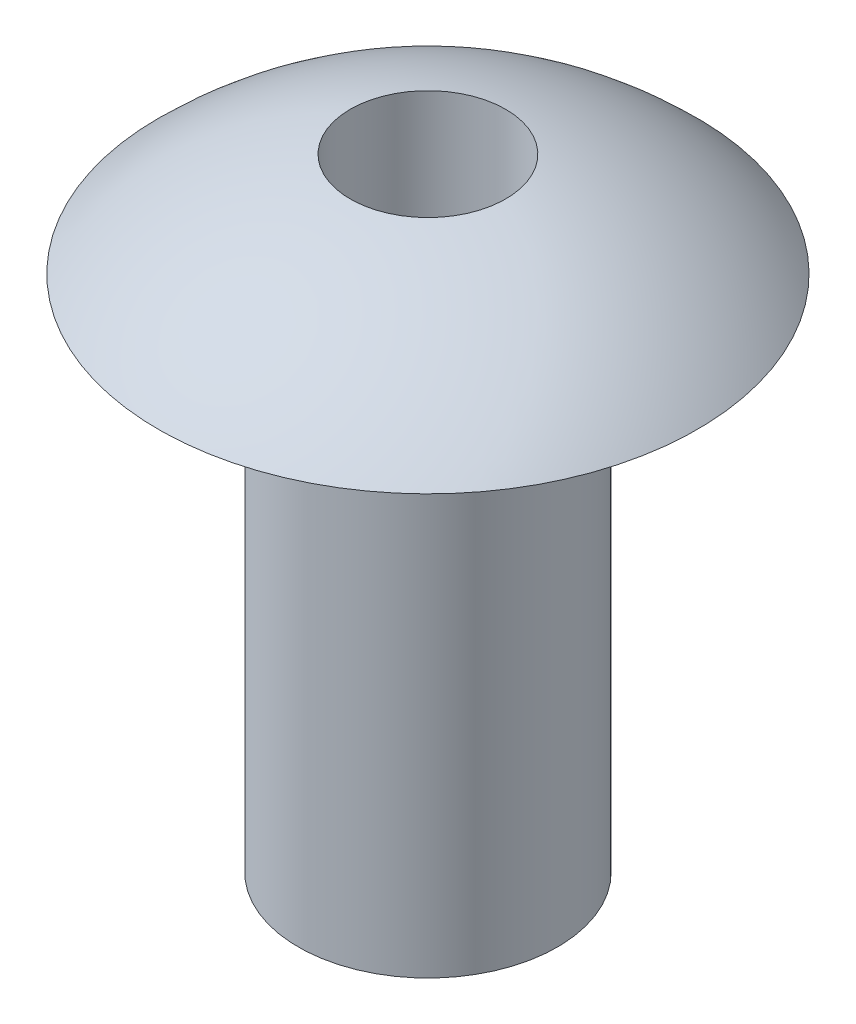
ISO-10303-21;
HEADER;
FILE_DESCRIPTION(('STEP AP214'),'2;1');
FILE_NAME('part.step','',(''),(''),'','','');
FILE_SCHEMA(('AUTOMOTIVE_DESIGN { 1 0 10303 214 1 1 1 1 }'));
ENDSEC;
DATA;
#1=APPLICATION_CONTEXT('core data for automotive mechanical design processes');
#2=APPLICATION_PROTOCOL_DEFINITION('international standard','automotive_design',2000,#1);
#3=PRODUCT_CONTEXT('',#1,'mechanical');
#4=PRODUCT('Part','Part','',(#3));
#5=PRODUCT_RELATED_PRODUCT_CATEGORY('part','',(#4));
#6=PRODUCT_DEFINITION_FORMATION('','',#4);
#7=PRODUCT_DEFINITION_CONTEXT('part definition',#1,'design');
#8=PRODUCT_DEFINITION('design','',#6,#7);
#9=PRODUCT_DEFINITION_SHAPE('','',#8);
#10=(LENGTH_UNIT() NAMED_UNIT(*) SI_UNIT(.MILLI.,.METRE.));
#11=(NAMED_UNIT(*) PLANE_ANGLE_UNIT() SI_UNIT($,.RADIAN.));
#12=(NAMED_UNIT(*) SI_UNIT($,.STERADIAN.) SOLID_ANGLE_UNIT());
#13=UNCERTAINTY_MEASURE_WITH_UNIT(LENGTH_MEASURE(1.E-05),#10,'distance_accuracy_value','');
#14=(GEOMETRIC_REPRESENTATION_CONTEXT(3) GLOBAL_UNCERTAINTY_ASSIGNED_CONTEXT((#13)) GLOBAL_UNIT_ASSIGNED_CONTEXT((#10,
#11,#12)) REPRESENTATION_CONTEXT('',''));
#15=CARTESIAN_POINT('',(0.,0.,0.));
#16=DIRECTION('',(0.,0.,1.));
#17=DIRECTION('',(1.,0.,0.));
#18=AXIS2_PLACEMENT_3D('',#15,#16,#17);
#19=CARTESIAN_POINT('',(0.,-2.8815,0.));
#20=DIRECTION('',(0.,1.,0.));
#21=DIRECTION('',(0.,0.,1.));
#22=AXIS2_PLACEMENT_3D('',#19,#20,#21);
#23=PLANE('',#22);
#24=CARTESIAN_POINT('',(0.,-2.8815,0.));
#25=DIRECTION('',(0.,-1.,0.));
#26=DIRECTION('',(0.,0.,-1.));
#27=AXIS2_PLACEMENT_3D('',#24,#25,#26);
#28=CIRCLE('',#27,1.50000000000337);
#29=CARTESIAN_POINT('',(0.,-2.8815,-1.50000000000337));
#30=VERTEX_POINT('',#29);
#31=EDGE_CURVE('E10',#30,#30,#28,.T.);
#32=ORIENTED_EDGE('',*,*,#31,.T.);
#33=EDGE_LOOP('',(#32));
#34=FACE_BOUND('',#33,.T.);
#35=ADVANCED_FACE('F34',(#34),#23,.F.);
#36=CARTESIAN_POINT('',(0.,-2.8815,0.));
#37=DIRECTION('',(0.,-1.,0.));
#38=DIRECTION('',(0.,0.,-1.));
#39=AXIS2_PLACEMENT_3D('',#36,#37,#38);
#40=CYLINDRICAL_SURFACE('',#39,1.50000000000337);
#41=ORIENTED_EDGE('',*,*,#31,.F.);
#42=EDGE_LOOP('',(#41));
#43=FACE_BOUND('',#42,.T.);
#44=CARTESIAN_POINT('',(0.,3.1185,0.));
#45=DIRECTION('',(0.,-1.,0.));
#46=DIRECTION('',(0.,0.,-1.));
#47=AXIS2_PLACEMENT_3D('',#44,#45,#46);
#48=CIRCLE('',#47,1.50000000000337);
#49=CARTESIAN_POINT('',(0.,3.1185,-1.50000000000337));
#50=VERTEX_POINT('',#49);
#51=EDGE_CURVE('E40',#50,#50,#48,.T.);
#52=ORIENTED_EDGE('',*,*,#51,.T.);
#53=EDGE_LOOP('',(#52));
#54=FACE_BOUND('',#53,.T.);
#55=ADVANCED_FACE('F69',(#43,#54),#40,.T.);
#56=CARTESIAN_POINT('',(-1.50000000000337,3.1185,0.));
#57=DIRECTION('',(0.,1.,0.));
#58=DIRECTION('',(0.,0.,1.));
#59=AXIS2_PLACEMENT_3D('',#56,#57,#58);
#60=PLANE('',#59);
#61=ORIENTED_EDGE('',*,*,#51,.F.);
#62=EDGE_LOOP('',(#61));
#63=FACE_BOUND('',#62,.T.);
#64=CARTESIAN_POINT('',(0.,3.1185,0.));
#65=DIRECTION('',(0.,-1.,0.));
#66=DIRECTION('',(0.,0.,-1.));
#67=AXIS2_PLACEMENT_3D('',#64,#65,#66);
#68=CIRCLE('',#67,3.12);
#69=CARTESIAN_POINT('',(-3.12,3.1185,0.));
#70=VERTEX_POINT('',#69);
#71=EDGE_CURVE('E44',#70,#70,#68,.T.);
#72=ORIENTED_EDGE('',*,*,#71,.T.);
#73=EDGE_LOOP('',(#72));
#74=FACE_BOUND('',#73,.T.);
#75=ADVANCED_FACE('F73',(#63,#74),#60,.F.);
#76=CARTESIAN_POINT('',(0.,0.,0.));
#77=DIRECTION('',(0.,-1.,0.));
#78=DIRECTION('',(-1.,0.,0.));
#79=AXIS2_PLACEMENT_3D('',#76,#77,#78);
#80=SPHERICAL_SURFACE('',#79,4.41128578194612);
#81=CARTESIAN_POINT('',(0.,4.3185,0.));
#82=DIRECTION('',(0.,-1.,0.));
#83=DIRECTION('',(0.,0.,-1.));
#84=AXIS2_PLACEMENT_3D('',#81,#82,#83);
#85=CIRCLE('',#84,0.9);
#86=CARTESIAN_POINT('',(-0.9,4.3185,0.));
#87=VERTEX_POINT('',#86);
#88=EDGE_CURVE('E48',#87,#87,#85,.T.);
#89=CARTESIAN_POINT('',(-3.12,3.1185,0.));
#90=CARTESIAN_POINT('',(-3.10115343443583,3.13735567112005,0.));
#91=CARTESIAN_POINT('',(-3.08213589932211,3.15604045362084,0.));
#92=CARTESIAN_POINT('',(-3.04376522812922,3.19306218979977,0.));
#93=CARTESIAN_POINT('',(-3.02441209205006,3.21139914347792,0.));
#94=CARTESIAN_POINT('',(-2.98537655706,3.24771917042746,0.));
#95=CARTESIAN_POINT('',(-2.9656941581491,3.26570224369885,0.));
#96=CARTESIAN_POINT('',(-2.92600657341747,3.30130860520783,0.));
#97=CARTESIAN_POINT('',(-2.90600138759674,3.31893189344542,0.));
#98=CARTESIAN_POINT('',(-2.86567480314847,3.35381289031372,0.));
#99=CARTESIAN_POINT('',(-2.84535340452092,3.37107059894442,0.));
#100=CARTESIAN_POINT('',(-2.80440107462448,3.40521476439267,0.));
#101=CARTESIAN_POINT('',(-2.7837701433556,3.42210122121023,0.));
#102=CARTESIAN_POINT('',(-2.74220552951783,3.45549733226838,0.));
#103=CARTESIAN_POINT('',(-2.72127184694895,3.47200698650899,0.));
#104=CARTESIAN_POINT('',(-2.67910861152036,3.50464406566374,0.));
#105=CARTESIAN_POINT('',(-2.65787905866064,3.52077149057788,0.));
#106=CARTESIAN_POINT('',(-2.61513106087232,3.55263880992803,0.));
#107=CARTESIAN_POINT('',(-2.59361261594371,3.56837870436404,0.));
#108=CARTESIAN_POINT('',(-2.55029390721039,3.59946578900025,0.));
#109=CARTESIAN_POINT('',(-2.52849364340567,3.61481297920045,0.));
#110=CARTESIAN_POINT('',(-2.48461846274482,3.64510961068765,0.));
#111=CARTESIAN_POINT('',(-2.46254354588869,3.66005905197464,0.));
#112=CARTESIAN_POINT('',(-2.41812631522996,3.68955527170032,0.));
#113=CARTESIAN_POINT('',(-2.39578400142737,3.70410205013901,0.));
#114=CARTESIAN_POINT('',(-2.3508393208748,3.7327881625895,0.));
#115=CARTESIAN_POINT('',(-2.32823695412483,3.74692749660131,0.));
#116=CARTESIAN_POINT('',(-2.28277959715696,3.77479407254797,0.));
#117=CARTESIAN_POINT('',(-2.25992460693907,3.78852131448283,0.));
#118=CARTESIAN_POINT('',(-2.21396951555308,3.81555919408165,0.));
#119=CARTESIAN_POINT('',(-2.19086941438498,3.82886983174563,0.));
#120=CARTESIAN_POINT('',(-2.14443169418514,3.85507012754809,0.));
#121=CARTESIAN_POINT('',(-2.1210940751534,3.86795978568657,0.));
#122=CARTESIAN_POINT('',(-2.0741889903858,3.89331388556095,0.));
#123=CARTESIAN_POINT('',(-2.05062152464995,3.90577832729684,0.));
#124=CARTESIAN_POINT('',(-2.00326449318512,3.93027789725907,0.));
#125=CARTESIAN_POINT('',(-1.97947492745614,3.94231302548541,0.));
#126=CARTESIAN_POINT('',(-1.9316815157211,3.96595001243848,0.));
#127=CARTESIAN_POINT('',(-1.90767766971504,3.97755187116522,0.));
#128=CARTESIAN_POINT('',(-1.85946358757659,4.0003185055463,0.));
#129=CARTESIAN_POINT('',(-1.83525335144419,4.01148328120064,0.));
#130=CARTESIAN_POINT('',(-1.786634447045,4.03337207953488,0.));
#131=CARTESIAN_POINT('',(-1.7622257787782,4.04409610221479,0.));
#132=CARTESIAN_POINT('',(-1.71321803332749,4.06509986957529,0.));
#133=CARTESIAN_POINT('',(-1.68861895614358,4.07537961425588,0.));
#134=CARTESIAN_POINT('',(-1.63923847866398,4.09549144662839,0.));
#135=CARTESIAN_POINT('',(-1.61445707836829,4.1053235343203,0.));
#136=CARTESIAN_POINT('',(-1.56472010040097,4.12453682087363,0.));
#137=CARTESIAN_POINT('',(-1.53976452272934,4.13391801973504,0.));
#138=CARTESIAN_POINT('',(-1.4896873929978,4.15222644499022,0.));
#139=CARTESIAN_POINT('',(-1.46456584093788,4.161153671384,0.));
#140=CARTESIAN_POINT('',(-1.41416501997726,4.1785512173045,0.));
#141=CARTESIAN_POINT('',(-1.38888575107656,4.18702153683124,0.));
#142=CARTESIAN_POINT('',(-1.33817780581094,4.20350248474788,0.));
#143=CARTESIAN_POINT('',(-1.31274912944603,4.21151311313778,0.));
#144=CARTESIAN_POINT('',(-1.261750727788,4.22707204582708,0.));
#145=CARTESIAN_POINT('',(-1.23618100249488,4.23462035012647,0.));
#146=CARTESIAN_POINT('',(-1.18490890769812,4.24925215285008,0.));
#147=CARTESIAN_POINT('',(-1.15920653819449,4.2563356512743,0.));
#148=CARTESIAN_POINT('',(-1.10767760397276,4.2700355162266,0.));
#149=CARTESIAN_POINT('',(-1.08185103925466,4.27665188275467,0.));
#150=CARTESIAN_POINT('',(-1.03008220189418,4.28941530031894,0.));
#151=CARTESIAN_POINT('',(-1.00413992925181,4.29556235135513,0.));
#152=CARTESIAN_POINT('',(-0.952148210805942,4.30738515011606,0.));
#153=CARTESIAN_POINT('',(-0.926098765002456,4.31306089784079,0.));
#154=CARTESIAN_POINT('',(-0.9,4.3185,0.));
#155=B_SPLINE_CURVE_WITH_KNOTS('',3,(#89,#90,#91,#92,#93,#94,#95,#96,#97,#98,#99,#100,#101,#102,
#103,#104,#105,#106,#107,#108,#109,#110,#111,#112,#113,#114,#115,#116,#117,#118,#119,#120,#121,
#122,#123,#124,#125,#126,#127,#128,#129,#130,#131,#132,#133,#134,#135,#136,#137,#138,#139,#140,
#141,#142,#143,#144,#145,#146,#147,#148,#149,#150,#151,#152,#153,#154),.UNSPECIFIED.,.F.,.F.,(4,
2,2,2,2,2,2,2,2,2,2,2,2,2,2,2,2,2,2,2,2,2,2,2,2,2,2,2,2,2,2,2,4),(0.,0.0799774270947195,
0.159954854189439,0.23993228128416,0.319909708378879,0.3998871354736,0.479864562568319,
0.559841989663039,0.639819416757759,0.719796843852479,0.799774270947199,0.879751698041919,
0.959729125136639,1.03970655223136,1.11968397932608,1.1996614064208,1.27963883351552,
1.35961626061024,1.43959368770496,1.51957111479968,1.5995485418944,1.67952596898912,
1.75950339608384,1.83948082317856,1.91945825027328,1.999435677368,2.07941310446272,
2.15939053155744,2.23936795865216,2.31934538574688,2.3993228128416,2.47930023993632,
2.55927766703104),.UNSPECIFIED.);
#156=EDGE_CURVE('BSEAM65',#70,#87,#155,.T.);
#157=ORIENTED_EDGE('',*,*,#71,.F.);
#158=ORIENTED_EDGE('',*,*,#88,.T.);
#159=ORIENTED_EDGE('',*,*,#156,.T.);
#160=ORIENTED_EDGE('',*,*,#156,.F.);
#161=EDGE_LOOP('',(#157,#159,#158,#160));
#162=FACE_BOUND('',#161,.T.);
#163=ADVANCED_FACE('F65',(#162),#80,.T.);
#164=CARTESIAN_POINT('',(0.,-2.8815,0.));
#165=DIRECTION('',(0.,-1.,0.));
#166=DIRECTION('',(0.,0.,-1.));
#167=AXIS2_PLACEMENT_3D('',#164,#165,#166);
#168=CYLINDRICAL_SURFACE('',#167,0.9);
#169=ORIENTED_EDGE('',*,*,#88,.F.);
#170=EDGE_LOOP('',(#169));
#171=FACE_BOUND('',#170,.T.);
#172=CARTESIAN_POINT('',(0.,1.9185,0.));
#173=DIRECTION('',(0.,-1.,0.));
#174=DIRECTION('',(0.,0.,-1.));
#175=AXIS2_PLACEMENT_3D('',#172,#173,#174);
#176=CIRCLE('',#175,0.9);
#177=CARTESIAN_POINT('',(0.,1.9185,-0.9));
#178=VERTEX_POINT('',#177);
#179=EDGE_CURVE('E53',#178,#178,#176,.T.);
#180=ORIENTED_EDGE('',*,*,#179,.T.);
#181=EDGE_LOOP('',(#180));
#182=FACE_BOUND('',#181,.T.);
#183=ADVANCED_FACE('F57',(#171,#182),#168,.F.);
#184=CARTESIAN_POINT('',(-0.9,1.9185,0.));
#185=DIRECTION('',(0.,-1.,0.));
#186=DIRECTION('',(0.,0.,-1.));
#187=AXIS2_PLACEMENT_3D('',#184,#185,#186);
#188=PLANE('',#187);
#189=ORIENTED_EDGE('',*,*,#179,.F.);
#190=EDGE_LOOP('',(#189));
#191=FACE_BOUND('',#190,.T.);
#192=ADVANCED_FACE('F59',(#191),#188,.F.);
#193=CLOSED_SHELL('',(#35,#55,#75,#163,#183,#192));
#194=MANIFOLD_SOLID_BREP('B2',#193);
#195=ADVANCED_BREP_SHAPE_REPRESENTATION('',(#18,#194),#14);
#196=SHAPE_DEFINITION_REPRESENTATION(#9,#195);
ENDSEC;
END-ISO-10303-21;
